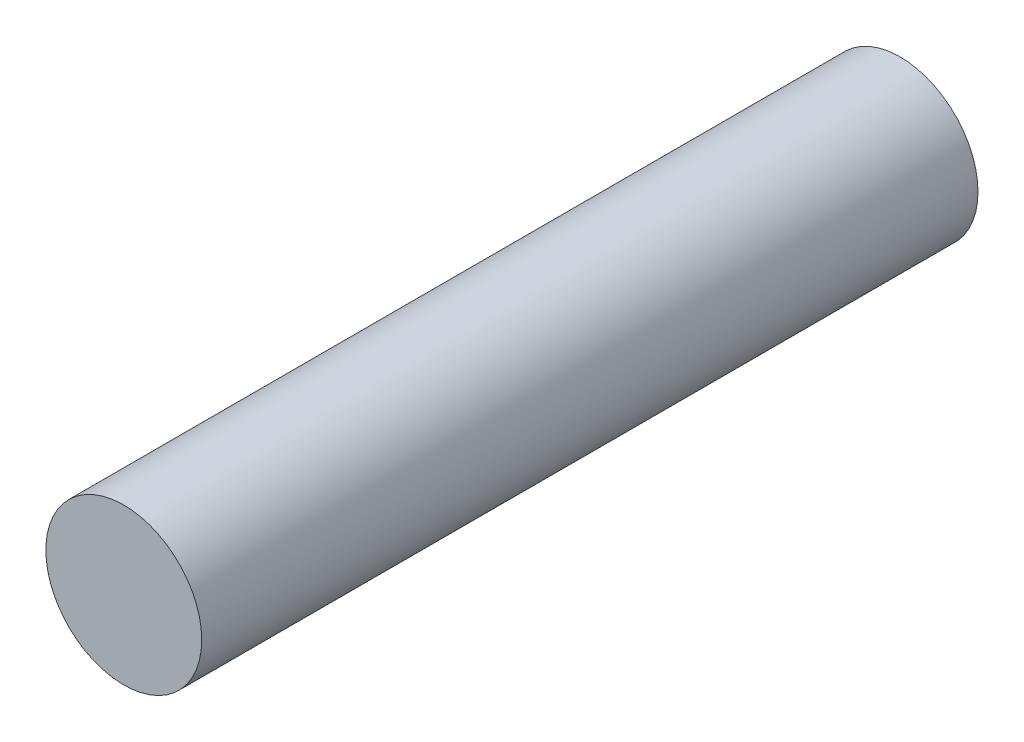
ISO-10303-21;
HEADER;
FILE_DESCRIPTION(('STEP AP214'),'2;1');
FILE_NAME('part.step','',(''),(''),'','','');
FILE_SCHEMA(('AUTOMOTIVE_DESIGN { 1 0 10303 214 1 1 1 1 }'));
ENDSEC;
DATA;
#1=APPLICATION_CONTEXT('core data for automotive mechanical design processes');
#2=APPLICATION_PROTOCOL_DEFINITION('international standard','automotive_design',2000,#1);
#3=PRODUCT_CONTEXT('',#1,'mechanical');
#4=PRODUCT('Part','Part','',(#3));
#5=PRODUCT_RELATED_PRODUCT_CATEGORY('part','',(#4));
#6=PRODUCT_DEFINITION_FORMATION('','',#4);
#7=PRODUCT_DEFINITION_CONTEXT('part definition',#1,'design');
#8=PRODUCT_DEFINITION('design','',#6,#7);
#9=PRODUCT_DEFINITION_SHAPE('','',#8);
#10=(LENGTH_UNIT() NAMED_UNIT(*) SI_UNIT(.MILLI.,.METRE.));
#11=(NAMED_UNIT(*) PLANE_ANGLE_UNIT() SI_UNIT($,.RADIAN.));
#12=(NAMED_UNIT(*) SI_UNIT($,.STERADIAN.) SOLID_ANGLE_UNIT());
#13=UNCERTAINTY_MEASURE_WITH_UNIT(LENGTH_MEASURE(1.E-05),#10,'distance_accuracy_value','');
#14=(GEOMETRIC_REPRESENTATION_CONTEXT(3) GLOBAL_UNCERTAINTY_ASSIGNED_CONTEXT((#13)) GLOBAL_UNIT_ASSIGNED_CONTEXT((#10,
#11,#12)) REPRESENTATION_CONTEXT('',''));
#15=CARTESIAN_POINT('',(0.,0.,0.));
#16=DIRECTION('',(0.,0.,1.));
#17=DIRECTION('',(1.,0.,0.));
#18=AXIS2_PLACEMENT_3D('',#15,#16,#17);
#19=CARTESIAN_POINT('',(0.,0.,31.75));
#20=DIRECTION('',(0.,0.,-1.));
#21=DIRECTION('',(-1.,0.,0.));
#22=AXIS2_PLACEMENT_3D('',#19,#20,#21);
#23=CYLINDRICAL_SURFACE('',#22,3.1877);
#24=CARTESIAN_POINT('',(0.,0.,31.75));
#25=DIRECTION('',(0.,0.,1.));
#26=DIRECTION('',(1.,0.,0.));
#27=AXIS2_PLACEMENT_3D('',#24,#25,#26);
#28=CIRCLE('',#27,3.1877);
#29=CARTESIAN_POINT('',(3.1877,0.,31.75));
#30=VERTEX_POINT('',#29);
#31=EDGE_CURVE('E10',#30,#30,#28,.T.);
#32=ORIENTED_EDGE('',*,*,#31,.F.);
#33=EDGE_LOOP('',(#32));
#34=FACE_BOUND('',#33,.T.);
#35=CARTESIAN_POINT('',(0.,0.,0.));
#36=DIRECTION('',(0.,0.,1.));
#37=DIRECTION('',(1.,0.,0.));
#38=AXIS2_PLACEMENT_3D('',#35,#36,#37);
#39=CIRCLE('',#38,3.1877);
#40=CARTESIAN_POINT('',(3.1877,0.,0.));
#41=VERTEX_POINT('',#40);
#42=EDGE_CURVE('E41',#41,#41,#39,.T.);
#43=ORIENTED_EDGE('',*,*,#42,.T.);
#44=EDGE_LOOP('',(#43));
#45=FACE_BOUND('',#44,.T.);
#46=ADVANCED_FACE('F38',(#34,#45),#23,.T.);
#47=CARTESIAN_POINT('',(0.,0.,31.75));
#48=DIRECTION('',(0.,0.,1.));
#49=DIRECTION('',(1.,0.,0.));
#50=AXIS2_PLACEMENT_3D('',#47,#48,#49);
#51=PLANE('',#50);
#52=ORIENTED_EDGE('',*,*,#31,.T.);
#53=EDGE_LOOP('',(#52));
#54=FACE_BOUND('',#53,.T.);
#55=ADVANCED_FACE('F55',(#54),#51,.T.);
#56=CARTESIAN_POINT('',(0.,0.,0.));
#57=DIRECTION('',(0.,0.,1.));
#58=DIRECTION('',(1.,0.,0.));
#59=AXIS2_PLACEMENT_3D('',#56,#57,#58);
#60=PLANE('',#59);
#61=ORIENTED_EDGE('',*,*,#42,.F.);
#62=EDGE_LOOP('',(#61));
#63=FACE_BOUND('',#62,.T.);
#64=ADVANCED_FACE('F53',(#63),#60,.F.);
#65=CLOSED_SHELL('',(#46,#55,#64));
#66=MANIFOLD_SOLID_BREP('B2',#65);
#67=ADVANCED_BREP_SHAPE_REPRESENTATION('',(#18,#66),#14);
#68=SHAPE_DEFINITION_REPRESENTATION(#9,#67);
ENDSEC;
END-ISO-10303-21;
